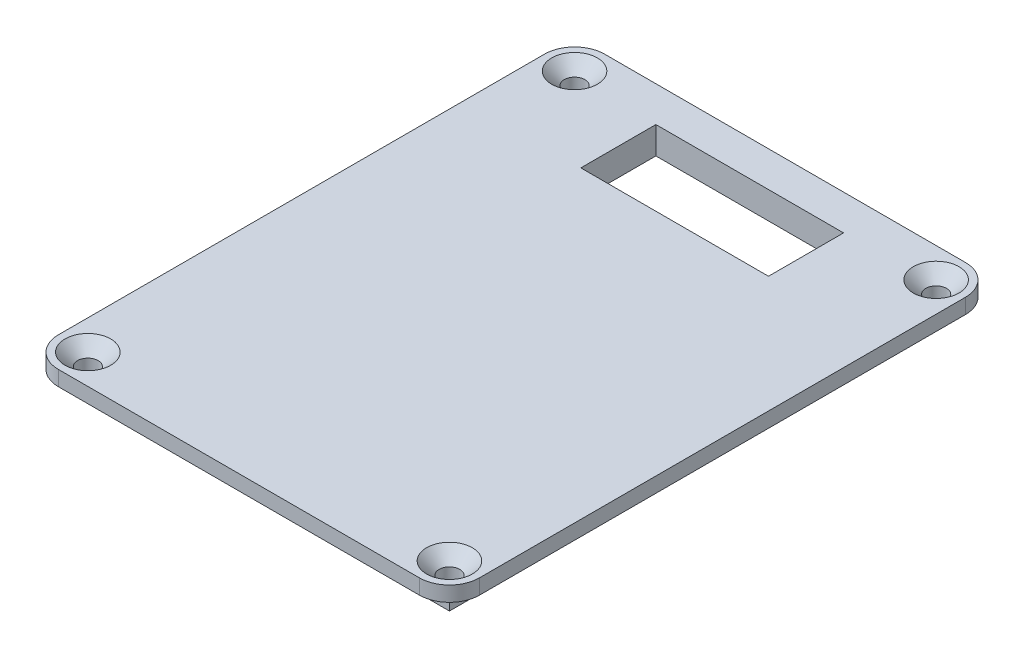
ISO-10303-21;
HEADER;
FILE_DESCRIPTION(('STEP AP214'),'2;1');
FILE_NAME('part.step','',(''),(''),'','','');
FILE_SCHEMA(('AUTOMOTIVE_DESIGN { 1 0 10303 214 1 1 1 1 }'));
ENDSEC;
DATA;
#1=APPLICATION_CONTEXT('core data for automotive mechanical design processes');
#2=APPLICATION_PROTOCOL_DEFINITION('international standard','automotive_design',2000,#1);
#3=PRODUCT_CONTEXT('',#1,'mechanical');
#4=PRODUCT('Part','Part','',(#3));
#5=PRODUCT_RELATED_PRODUCT_CATEGORY('part','',(#4));
#6=PRODUCT_DEFINITION_FORMATION('','',#4);
#7=PRODUCT_DEFINITION_CONTEXT('part definition',#1,'design');
#8=PRODUCT_DEFINITION('design','',#6,#7);
#9=PRODUCT_DEFINITION_SHAPE('','',#8);
#10=(LENGTH_UNIT() NAMED_UNIT(*) SI_UNIT(.MILLI.,.METRE.));
#11=(NAMED_UNIT(*) PLANE_ANGLE_UNIT() SI_UNIT($,.RADIAN.));
#12=(NAMED_UNIT(*) SI_UNIT($,.STERADIAN.) SOLID_ANGLE_UNIT());
#13=UNCERTAINTY_MEASURE_WITH_UNIT(LENGTH_MEASURE(1.E-05),#10,'distance_accuracy_value','');
#14=(GEOMETRIC_REPRESENTATION_CONTEXT(3) GLOBAL_UNCERTAINTY_ASSIGNED_CONTEXT((#13)) GLOBAL_UNIT_ASSIGNED_CONTEXT((#10,
#11,#12)) REPRESENTATION_CONTEXT('',''));
#15=CARTESIAN_POINT('',(0.,0.,0.));
#16=DIRECTION('',(0.,0.,1.));
#17=DIRECTION('',(1.,0.,0.));
#18=AXIS2_PLACEMENT_3D('',#15,#16,#17);
#19=CARTESIAN_POINT('',(-34.115,7.14999999999999,-40.));
#20=DIRECTION('',(0.,1.,0.));
#21=DIRECTION('',(0.,0.,1.));
#22=AXIS2_PLACEMENT_3D('',#19,#20,#21);
#23=PLANE('',#22);
#24=DIRECTION('',(1.,0.,0.));
#25=VECTOR('',#24,1.);
#26=CARTESIAN_POINT('',(15.,7.14999999999999,-38.));
#27=LINE('',#26,#25);
#28=CARTESIAN_POINT('',(-15.,7.14999999999999,-38.));
#29=VERTEX_POINT('',#28);
#30=CARTESIAN_POINT('',(15.,7.14999999999999,-38.));
#31=VERTEX_POINT('',#30);
#32=EDGE_CURVE('E277',#29,#31,#27,.T.);
#33=ORIENTED_EDGE('',*,*,#32,.F.);
#34=DIRECTION('',(0.,0.,-1.));
#35=VECTOR('',#34,1.);
#36=CARTESIAN_POINT('',(-15.,7.14999999999999,-26.));
#37=LINE('',#36,#35);
#38=CARTESIAN_POINT('',(-15.,7.14999999999999,-26.));
#39=VERTEX_POINT('',#38);
#40=EDGE_CURVE('E265',#39,#29,#37,.T.);
#41=ORIENTED_EDGE('',*,*,#40,.F.);
#42=DIRECTION('',(-1.,0.,0.));
#43=VECTOR('',#42,1.);
#44=CARTESIAN_POINT('',(15.,7.14999999999999,-26.));
#45=LINE('',#44,#43);
#46=CARTESIAN_POINT('',(15.,7.14999999999999,-26.));
#47=VERTEX_POINT('',#46);
#48=EDGE_CURVE('E271',#47,#39,#45,.T.);
#49=ORIENTED_EDGE('',*,*,#48,.F.);
#50=DIRECTION('',(0.,0.,1.));
#51=VECTOR('',#50,1.);
#52=CARTESIAN_POINT('',(15.,7.14999999999999,-26.));
#53=LINE('',#52,#51);
#54=EDGE_CURVE('E62',#31,#47,#53,.T.);
#55=ORIENTED_EDGE('',*,*,#54,.F.);
#56=EDGE_LOOP('',(#33,#41,#49,#55));
#57=FACE_BOUND('',#56,.T.);
#58=DIRECTION('',(0.,0.,1.));
#59=VECTOR('',#58,1.);
#60=CARTESIAN_POINT('',(31.5,7.14999999999999,-44.115));
#61=LINE('',#60,#59);
#62=CARTESIAN_POINT('',(31.5,7.14999999999999,-41.5));
#63=VERTEX_POINT('',#62);
#64=CARTESIAN_POINT('',(31.5,7.14999999999999,-19.5));
#65=VERTEX_POINT('',#64);
#66=EDGE_CURVE('E417',#63,#65,#61,.T.);
#67=ORIENTED_EDGE('',*,*,#66,.T.);
#68=DIRECTION('',(1.,0.,0.));
#69=VECTOR('',#68,1.);
#70=CARTESIAN_POINT('',(-29.9999999999999,7.14999999999999,-19.5));
#71=LINE('',#70,#69);
#72=CARTESIAN_POINT('',(-29.9999999999999,7.14999999999999,-19.5));
#73=VERTEX_POINT('',#72);
#74=EDGE_CURVE('E305',#73,#65,#71,.T.);
#75=ORIENTED_EDGE('',*,*,#74,.F.);
#76=DIRECTION('',(0.,0.,-1.));
#77=VECTOR('',#76,1.);
#78=CARTESIAN_POINT('',(-29.9999999999999,7.14999999999999,35.5));
#79=LINE('',#78,#77);
#80=CARTESIAN_POINT('',(-29.9999999999999,7.14999999999999,0.));
#81=VERTEX_POINT('',#80);
#82=EDGE_CURVE('E11',#81,#73,#79,.T.);
#83=ORIENTED_EDGE('',*,*,#82,.F.);
#84=DIRECTION('',(1.,0.,0.));
#85=VECTOR('',#84,1.);
#86=CARTESIAN_POINT('',(-30.,7.14999999999999,0.));
#87=LINE('',#86,#85);
#88=CARTESIAN_POINT('',(-31.5,7.14999999999999,0.));
#89=VERTEX_POINT('',#88);
#90=EDGE_CURVE('E452',#89,#81,#87,.T.);
#91=ORIENTED_EDGE('',*,*,#90,.F.);
#92=DIRECTION('',(0.,0.,-1.));
#93=VECTOR('',#92,1.);
#94=CARTESIAN_POINT('',(-31.5,7.14999999999999,0.));
#95=LINE('',#94,#93);
#96=CARTESIAN_POINT('',(-31.5,7.14999999999999,-41.5));
#97=VERTEX_POINT('',#96);
#98=EDGE_CURVE('E448',#89,#97,#95,.T.);
#99=ORIENTED_EDGE('',*,*,#98,.T.);
#100=DIRECTION('',(1.,0.,0.));
#101=VECTOR('',#100,1.);
#102=CARTESIAN_POINT('',(-34.115,7.14999999999999,-41.5));
#103=LINE('',#102,#101);
#104=EDGE_CURVE('E371',#97,#63,#103,.T.);
#105=ORIENTED_EDGE('',*,*,#104,.T.);
#106=EDGE_LOOP('',(#67,#75,#83,#91,#99,#105));
#107=FACE_BOUND('',#106,.T.);
#108=CARTESIAN_POINT('',(28.9,7.14999999999999,-38.9));
#109=DIRECTION('',(0.,1.,0.));
#110=DIRECTION('',(0.,0.,1.));
#111=AXIS2_PLACEMENT_3D('',#108,#109,#110);
#112=CIRCLE('',#111,1.65);
#113=CARTESIAN_POINT('',(30.0667261889578,7.14999999999999,-40.0667261889578));
#114=VERTEX_POINT('',#113);
#115=EDGE_CURVE('E486',#114,#114,#112,.T.);
#116=ORIENTED_EDGE('',*,*,#115,.T.);
#117=EDGE_LOOP('',(#116));
#118=FACE_BOUND('',#117,.T.);
#119=CARTESIAN_POINT('',(-28.9,7.14999999999999,-38.9));
#120=DIRECTION('',(0.,1.,0.));
#121=DIRECTION('',(0.,0.,1.));
#122=AXIS2_PLACEMENT_3D('',#119,#120,#121);
#123=CIRCLE('',#122,1.65);
#124=CARTESIAN_POINT('',(-30.0667261889578,7.14999999999999,-40.0667261889578));
#125=VERTEX_POINT('',#124);
#126=EDGE_CURVE('E491',#125,#125,#123,.T.);
#127=ORIENTED_EDGE('',*,*,#126,.T.);
#128=EDGE_LOOP('',(#127));
#129=FACE_BOUND('',#128,.T.);
#130=ADVANCED_FACE('F43',(#57,#107,#118,#129),#23,.F.);
#131=CARTESIAN_POINT('',(34.115,9.09999999999999,41.5));
#132=DIRECTION('',(0.,1.,0.));
#133=DIRECTION('',(0.,0.,1.));
#134=AXIS2_PLACEMENT_3D('',#131,#132,#133);
#135=PLANE('',#134);
#136=CARTESIAN_POINT('',(-28.8499999999999,9.09999999999999,38.85));
#137=DIRECTION('',(0.,1.,0.));
#138=DIRECTION('',(0.,0.,1.));
#139=AXIS2_PLACEMENT_3D('',#136,#137,#138);
#140=CIRCLE('',#139,4.8);
#141=CARTESIAN_POINT('',(-32.2441125496954,9.09999999999999,42.2441125496954));
#142=VERTEX_POINT('',#141);
#143=CARTESIAN_POINT('',(-28.8499999999999,9.09999999999999,43.65));
#144=VERTEX_POINT('',#143);
#145=EDGE_CURVE('E367',#142,#144,#140,.T.);
#146=ORIENTED_EDGE('',*,*,#145,.F.);
#147=DIRECTION('',(-0.707106781186547,0.,0.707106781186548));
#148=VECTOR('',#147,1.);
#149=CARTESIAN_POINT('',(-32.8075,9.09999999999999,42.8075));
#150=LINE('',#149,#148);
#151=CARTESIAN_POINT('',(-31.5,9.09999999999999,41.5));
#152=VERTEX_POINT('',#151);
#153=EDGE_CURVE('E442',#152,#142,#150,.T.);
#154=ORIENTED_EDGE('',*,*,#153,.F.);
#155=DIRECTION('',(-1.,0.,0.));
#156=VECTOR('',#155,1.);
#157=CARTESIAN_POINT('',(34.115,9.09999999999999,41.5));
#158=LINE('',#157,#156);
#159=CARTESIAN_POINT('',(31.5,9.09999999999999,41.5));
#160=VERTEX_POINT('',#159);
#161=EDGE_CURVE('E471',#160,#152,#158,.T.);
#162=ORIENTED_EDGE('',*,*,#161,.F.);
#163=DIRECTION('',(0.707106781186548,0.,0.707106781186548));
#164=VECTOR('',#163,1.);
#165=CARTESIAN_POINT('',(-11.3075,9.09999999999999,-1.30749999999999));
#166=LINE('',#165,#164);
#167=CARTESIAN_POINT('',(32.2441125496954,9.09999999999999,42.2441125496954));
#168=VERTEX_POINT('',#167);
#169=EDGE_CURVE('E391',#160,#168,#166,.T.);
#170=ORIENTED_EDGE('',*,*,#169,.T.);
#171=CARTESIAN_POINT('',(28.85,9.09999999999999,38.85));
#172=DIRECTION('',(0.,1.,0.));
#173=DIRECTION('',(0.,0.,1.));
#174=AXIS2_PLACEMENT_3D('',#171,#172,#173);
#175=CIRCLE('',#174,4.8);
#176=CARTESIAN_POINT('',(28.85,9.09999999999999,43.65));
#177=VERTEX_POINT('',#176);
#178=EDGE_CURVE('E362',#177,#168,#175,.T.);
#179=ORIENTED_EDGE('',*,*,#178,.F.);
#180=DIRECTION('',(-1.,0.,0.));
#181=VECTOR('',#180,1.);
#182=CARTESIAN_POINT('',(34.115,9.09999999999999,43.65));
#183=LINE('',#182,#181);
#184=EDGE_CURVE('E477',#177,#144,#183,.T.);
#185=ORIENTED_EDGE('',*,*,#184,.T.);
#186=EDGE_LOOP('',(#146,#154,#162,#170,#179,#185));
#187=FACE_BOUND('',#186,.T.);
#188=ADVANCED_FACE('F595',(#187),#135,.F.);
#189=CARTESIAN_POINT('',(34.115,9.09999999999999,43.65));
#190=DIRECTION('',(0.,0.,-1.));
#191=DIRECTION('',(-1.,0.,0.));
#192=AXIS2_PLACEMENT_3D('',#189,#190,#191);
#193=PLANE('',#192);
#194=DIRECTION('',(0.,1.,0.));
#195=VECTOR('',#194,1.);
#196=CARTESIAN_POINT('',(-28.8499999999999,-11.5,43.65));
#197=LINE('',#196,#195);
#198=CARTESIAN_POINT('',(-28.8499999999999,11.5,43.65));
#199=VERTEX_POINT('',#198);
#200=EDGE_CURVE('E334',#144,#199,#197,.T.);
#201=ORIENTED_EDGE('',*,*,#200,.F.);
#202=ORIENTED_EDGE('',*,*,#184,.F.);
#203=DIRECTION('',(0.,1.,0.));
#204=VECTOR('',#203,1.);
#205=CARTESIAN_POINT('',(28.85,-11.5,43.65));
#206=LINE('',#205,#204);
#207=CARTESIAN_POINT('',(28.85,11.5,43.65));
#208=VERTEX_POINT('',#207);
#209=EDGE_CURVE('E353',#177,#208,#206,.T.);
#210=ORIENTED_EDGE('',*,*,#209,.T.);
#211=DIRECTION('',(-1.,0.,0.));
#212=VECTOR('',#211,1.);
#213=CARTESIAN_POINT('',(34.115,11.5,43.65));
#214=LINE('',#213,#212);
#215=EDGE_CURVE('E432',#208,#199,#214,.T.);
#216=ORIENTED_EDGE('',*,*,#215,.T.);
#217=EDGE_LOOP('',(#201,#202,#210,#216));
#218=FACE_BOUND('',#217,.T.);
#219=ADVANCED_FACE('F599',(#218),#193,.F.);
#220=CARTESIAN_POINT('',(-31.5,9.09999999999999,44.115));
#221=DIRECTION('',(0.,1.,0.));
#222=DIRECTION('',(0.,0.,1.));
#223=AXIS2_PLACEMENT_3D('',#220,#221,#222);
#224=PLANE('',#223);
#225=CARTESIAN_POINT('',(-28.8499999999999,9.09999999999999,38.85));
#226=DIRECTION('',(0.,1.,0.));
#227=DIRECTION('',(0.,0.,1.));
#228=AXIS2_PLACEMENT_3D('',#225,#226,#227);
#229=CIRCLE('',#228,4.8);
#230=CARTESIAN_POINT('',(-33.65,9.09999999999999,38.85));
#231=VERTEX_POINT('',#230);
#232=EDGE_CURVE('E366',#231,#142,#229,.T.);
#233=ORIENTED_EDGE('',*,*,#232,.F.);
#234=DIRECTION('',(0.,0.,-1.));
#235=VECTOR('',#234,1.);
#236=CARTESIAN_POINT('',(-33.65,9.09999999999999,44.115));
#237=LINE('',#236,#235);
#238=CARTESIAN_POINT('',(-33.65,9.09999999999999,0.));
#239=VERTEX_POINT('',#238);
#240=EDGE_CURVE('E428',#231,#239,#237,.T.);
#241=ORIENTED_EDGE('',*,*,#240,.T.);
#242=DIRECTION('',(1.,0.,0.));
#243=VECTOR('',#242,1.);
#244=CARTESIAN_POINT('',(-31.5,9.09999999999999,0.));
#245=LINE('',#244,#243);
#246=CARTESIAN_POINT('',(-31.5,9.09999999999999,0.));
#247=VERTEX_POINT('',#246);
#248=EDGE_CURVE('E437',#239,#247,#245,.T.);
#249=ORIENTED_EDGE('',*,*,#248,.T.);
#250=DIRECTION('',(0.,0.,-1.));
#251=VECTOR('',#250,1.);
#252=CARTESIAN_POINT('',(-31.5,9.09999999999999,44.115));
#253=LINE('',#252,#251);
#254=EDGE_CURVE('E435',#152,#247,#253,.T.);
#255=ORIENTED_EDGE('',*,*,#254,.F.);
#256=ORIENTED_EDGE('',*,*,#153,.T.);
#257=EDGE_LOOP('',(#233,#241,#249,#255,#256));
#258=FACE_BOUND('',#257,.T.);
#259=ADVANCED_FACE('F654',(#258),#224,.F.);
#260=CARTESIAN_POINT('',(-31.5,9.09999999999999,0.));
#261=DIRECTION('',(0.,1.,0.));
#262=DIRECTION('',(0.,0.,1.));
#263=AXIS2_PLACEMENT_3D('',#260,#261,#262);
#264=PLANE('',#263);
#265=CARTESIAN_POINT('',(-28.85,9.09999999999999,-38.85));
#266=DIRECTION('',(0.,1.,0.));
#267=DIRECTION('',(0.,0.,1.));
#268=AXIS2_PLACEMENT_3D('',#265,#266,#267);
#269=CIRCLE('',#268,4.79999999999999);
#270=CARTESIAN_POINT('',(-32.2441125496954,9.09999999999999,-42.2441125496954));
#271=VERTEX_POINT('',#270);
#272=CARTESIAN_POINT('',(-33.6499999999999,9.09999999999999,-38.85));
#273=VERTEX_POINT('',#272);
#274=EDGE_CURVE('E359',#271,#273,#269,.T.);
#275=ORIENTED_EDGE('',*,*,#274,.F.);
#276=DIRECTION('',(-0.707106781186548,0.,-0.707106781186548));
#277=VECTOR('',#276,1.);
#278=CARTESIAN_POINT('',(-32.8075,9.09999999999999,-42.8075));
#279=LINE('',#278,#277);
#280=CARTESIAN_POINT('',(-31.5,9.09999999999999,-41.5));
#281=VERTEX_POINT('',#280);
#282=EDGE_CURVE('E384',#281,#271,#279,.T.);
#283=ORIENTED_EDGE('',*,*,#282,.F.);
#284=DIRECTION('',(0.,0.,-1.));
#285=VECTOR('',#284,1.);
#286=CARTESIAN_POINT('',(-31.5,9.09999999999999,0.));
#287=LINE('',#286,#285);
#288=EDGE_CURVE('E467',#247,#281,#287,.T.);
#289=ORIENTED_EDGE('',*,*,#288,.F.);
#290=ORIENTED_EDGE('',*,*,#248,.F.);
#291=DIRECTION('',(0.,0.,-1.));
#292=VECTOR('',#291,1.);
#293=CARTESIAN_POINT('',(-33.65,9.09999999999999,0.));
#294=LINE('',#293,#292);
#295=EDGE_CURVE('E464',#239,#273,#294,.T.);
#296=ORIENTED_EDGE('',*,*,#295,.T.);
#297=EDGE_LOOP('',(#275,#283,#289,#290,#296));
#298=FACE_BOUND('',#297,.T.);
#299=ADVANCED_FACE('F650',(#298),#264,.F.);
#300=CARTESIAN_POINT('',(31.5,9.09999999999999,-44.115));
#301=DIRECTION('',(0.,1.,0.));
#302=DIRECTION('',(0.,0.,1.));
#303=AXIS2_PLACEMENT_3D('',#300,#301,#302);
#304=PLANE('',#303);
#305=CARTESIAN_POINT('',(28.85,9.09999999999999,-38.85));
#306=DIRECTION('',(0.,1.,0.));
#307=DIRECTION('',(0.,0.,1.));
#308=AXIS2_PLACEMENT_3D('',#305,#306,#307);
#309=CIRCLE('',#308,4.8);
#310=CARTESIAN_POINT('',(33.65,9.09999999999999,-38.85));
#311=VERTEX_POINT('',#310);
#312=CARTESIAN_POINT('',(32.2441125496954,9.09999999999999,-42.2441125496954));
#313=VERTEX_POINT('',#312);
#314=EDGE_CURVE('E356',#311,#313,#309,.T.);
#315=ORIENTED_EDGE('',*,*,#314,.F.);
#316=DIRECTION('',(0.,0.,1.));
#317=VECTOR('',#316,1.);
#318=CARTESIAN_POINT('',(33.65,9.09999999999999,-44.115));
#319=LINE('',#318,#317);
#320=CARTESIAN_POINT('',(33.65,9.09999999999999,38.85));
#321=VERTEX_POINT('',#320);
#322=EDGE_CURVE('E425',#311,#321,#319,.T.);
#323=ORIENTED_EDGE('',*,*,#322,.T.);
#324=CARTESIAN_POINT('',(28.85,9.09999999999999,38.85));
#325=DIRECTION('',(0.,1.,0.));
#326=DIRECTION('',(0.,0.,1.));
#327=AXIS2_PLACEMENT_3D('',#324,#325,#326);
#328=CIRCLE('',#327,4.8);
#329=EDGE_CURVE('E365',#168,#321,#328,.T.);
#330=ORIENTED_EDGE('',*,*,#329,.F.);
#331=ORIENTED_EDGE('',*,*,#169,.F.);
#332=DIRECTION('',(0.,0.,1.));
#333=VECTOR('',#332,1.);
#334=CARTESIAN_POINT('',(31.5,9.09999999999999,-44.115));
#335=LINE('',#334,#333);
#336=CARTESIAN_POINT('',(31.5,9.09999999999999,-41.5));
#337=VERTEX_POINT('',#336);
#338=EDGE_CURVE('E416',#337,#160,#335,.T.);
#339=ORIENTED_EDGE('',*,*,#338,.F.);
#340=DIRECTION('',(0.707106781186547,0.,-0.707106781186548));
#341=VECTOR('',#340,1.);
#342=CARTESIAN_POINT('',(-1.30749999999998,9.09999999999999,-8.69250000000002));
#343=LINE('',#342,#341);
#344=EDGE_CURVE('E378',#337,#313,#343,.T.);
#345=ORIENTED_EDGE('',*,*,#344,.T.);
#346=EDGE_LOOP('',(#315,#323,#330,#331,#339,#345));
#347=FACE_BOUND('',#346,.T.);
#348=ADVANCED_FACE('F564',(#347),#304,.F.);
#349=CARTESIAN_POINT('',(33.65,9.09999999999999,-44.115));
#350=DIRECTION('',(-1.,0.,0.));
#351=DIRECTION('',(0.,0.,1.));
#352=AXIS2_PLACEMENT_3D('',#349,#350,#351);
#353=PLANE('',#352);
#354=DIRECTION('',(0.,1.,0.));
#355=VECTOR('',#354,1.);
#356=CARTESIAN_POINT('',(33.65,-11.5,38.85));
#357=LINE('',#356,#355);
#358=CARTESIAN_POINT('',(33.65,11.5,38.85));
#359=VERTEX_POINT('',#358);
#360=EDGE_CURVE('E350',#321,#359,#357,.T.);
#361=ORIENTED_EDGE('',*,*,#360,.F.);
#362=ORIENTED_EDGE('',*,*,#322,.F.);
#363=DIRECTION('',(0.,1.,0.));
#364=VECTOR('',#363,1.);
#365=CARTESIAN_POINT('',(33.65,-11.5,-38.85));
#366=LINE('',#365,#364);
#367=CARTESIAN_POINT('',(33.65,11.5,-38.85));
#368=VERTEX_POINT('',#367);
#369=EDGE_CURVE('E339',#311,#368,#366,.T.);
#370=ORIENTED_EDGE('',*,*,#369,.T.);
#371=DIRECTION('',(0.,0.,1.));
#372=VECTOR('',#371,1.);
#373=CARTESIAN_POINT('',(33.65,11.5,-44.115));
#374=LINE('',#373,#372);
#375=EDGE_CURVE('E414',#368,#359,#374,.T.);
#376=ORIENTED_EDGE('',*,*,#375,.T.);
#377=EDGE_LOOP('',(#361,#362,#370,#376));
#378=FACE_BOUND('',#377,.T.);
#379=ADVANCED_FACE('F670',(#378),#353,.F.);
#380=CARTESIAN_POINT('',(-34.115,9.09999999999999,-41.5));
#381=DIRECTION('',(0.,1.,0.));
#382=DIRECTION('',(0.,0.,1.));
#383=AXIS2_PLACEMENT_3D('',#380,#381,#382);
#384=PLANE('',#383);
#385=CARTESIAN_POINT('',(-28.85,9.09999999999999,-38.85));
#386=DIRECTION('',(0.,1.,0.));
#387=DIRECTION('',(0.,0.,1.));
#388=AXIS2_PLACEMENT_3D('',#385,#386,#387);
#389=CIRCLE('',#388,4.79999999999999);
#390=CARTESIAN_POINT('',(-28.85,9.09999999999999,-43.65));
#391=VERTEX_POINT('',#390);
#392=EDGE_CURVE('E358',#391,#271,#389,.T.);
#393=ORIENTED_EDGE('',*,*,#392,.F.);
#394=DIRECTION('',(1.,0.,0.));
#395=VECTOR('',#394,1.);
#396=CARTESIAN_POINT('',(-34.115,9.09999999999999,-43.65));
#397=LINE('',#396,#395);
#398=CARTESIAN_POINT('',(28.85,9.09999999999999,-43.6499999999999));
#399=VERTEX_POINT('',#398);
#400=EDGE_CURVE('E399',#391,#399,#397,.T.);
#401=ORIENTED_EDGE('',*,*,#400,.T.);
#402=CARTESIAN_POINT('',(28.85,9.09999999999999,-38.85));
#403=DIRECTION('',(0.,1.,0.));
#404=DIRECTION('',(0.,0.,1.));
#405=AXIS2_PLACEMENT_3D('',#402,#403,#404);
#406=CIRCLE('',#405,4.8);
#407=EDGE_CURVE('E337',#313,#399,#406,.T.);
#408=ORIENTED_EDGE('',*,*,#407,.F.);
#409=ORIENTED_EDGE('',*,*,#344,.F.);
#410=DIRECTION('',(1.,0.,0.));
#411=VECTOR('',#410,1.);
#412=CARTESIAN_POINT('',(-34.115,9.09999999999999,-41.5));
#413=LINE('',#412,#411);
#414=EDGE_CURVE('E398',#281,#337,#413,.T.);
#415=ORIENTED_EDGE('',*,*,#414,.F.);
#416=ORIENTED_EDGE('',*,*,#282,.T.);
#417=EDGE_LOOP('',(#393,#401,#408,#409,#415,#416));
#418=FACE_BOUND('',#417,.T.);
#419=ADVANCED_FACE('F560',(#418),#384,.F.);
#420=CARTESIAN_POINT('',(-34.115,9.09999999999999,-43.65));
#421=DIRECTION('',(0.,0.,1.));
#422=DIRECTION('',(1.,0.,0.));
#423=AXIS2_PLACEMENT_3D('',#420,#421,#422);
#424=PLANE('',#423);
#425=DIRECTION('',(0.,1.,0.));
#426=VECTOR('',#425,1.);
#427=CARTESIAN_POINT('',(28.85,-11.5,-43.6499999999999));
#428=LINE('',#427,#426);
#429=CARTESIAN_POINT('',(28.85,11.5,-43.6499999999999));
#430=VERTEX_POINT('',#429);
#431=EDGE_CURVE('E345',#399,#430,#428,.T.);
#432=ORIENTED_EDGE('',*,*,#431,.F.);
#433=ORIENTED_EDGE('',*,*,#400,.F.);
#434=DIRECTION('',(0.,1.,0.));
#435=VECTOR('',#434,1.);
#436=CARTESIAN_POINT('',(-28.85,-11.5,-43.6499999999999));
#437=LINE('',#436,#435);
#438=CARTESIAN_POINT('',(-28.85,11.5,-43.6499999999999));
#439=VERTEX_POINT('',#438);
#440=EDGE_CURVE('E338',#391,#439,#437,.T.);
#441=ORIENTED_EDGE('',*,*,#440,.T.);
#442=DIRECTION('',(1.,0.,0.));
#443=VECTOR('',#442,1.);
#444=CARTESIAN_POINT('',(-34.115,11.5,-43.65));
#445=LINE('',#444,#443);
#446=EDGE_CURVE('E341',#439,#430,#445,.T.);
#447=ORIENTED_EDGE('',*,*,#446,.T.);
#448=EDGE_LOOP('',(#432,#433,#441,#447));
#449=FACE_BOUND('',#448,.T.);
#450=ADVANCED_FACE('F608',(#449),#424,.F.);
#451=CARTESIAN_POINT('',(34.115,7.14999999999999,41.5));
#452=DIRECTION('',(0.,0.,-1.));
#453=DIRECTION('',(-1.,0.,0.));
#454=AXIS2_PLACEMENT_3D('',#451,#452,#453);
#455=PLANE('',#454);
#456=DIRECTION('',(-1.,0.,0.));
#457=VECTOR('',#456,1.);
#458=CARTESIAN_POINT('',(34.115,7.14999999999999,41.5));
#459=LINE('',#458,#457);
#460=CARTESIAN_POINT('',(31.5,7.14999999999999,41.5));
#461=VERTEX_POINT('',#460);
#462=CARTESIAN_POINT('',(-31.5,7.14999999999999,41.5));
#463=VERTEX_POINT('',#462);
#464=EDGE_CURVE('E369',#461,#463,#459,.T.);
#465=ORIENTED_EDGE('',*,*,#464,.F.);
#466=DIRECTION('',(0.,1.,0.));
#467=VECTOR('',#466,1.);
#468=CARTESIAN_POINT('',(31.5,7.14999999999999,41.5));
#469=LINE('',#468,#467);
#470=EDGE_CURVE('E406',#461,#160,#469,.T.);
#471=ORIENTED_EDGE('',*,*,#470,.T.);
#472=ORIENTED_EDGE('',*,*,#161,.T.);
#473=DIRECTION('',(0.,1.,0.));
#474=VECTOR('',#473,1.);
#475=CARTESIAN_POINT('',(-31.5,7.14999999999999,41.5));
#476=LINE('',#475,#474);
#477=EDGE_CURVE('E441',#463,#152,#476,.T.);
#478=ORIENTED_EDGE('',*,*,#477,.F.);
#479=EDGE_LOOP('',(#465,#471,#472,#478));
#480=FACE_BOUND('',#479,.T.);
#481=ADVANCED_FACE('F568',(#480),#455,.F.);
#482=CARTESIAN_POINT('',(-33.65,9.09999999999999,44.115));
#483=DIRECTION('',(1.,0.,0.));
#484=DIRECTION('',(0.,0.,-1.));
#485=AXIS2_PLACEMENT_3D('',#482,#483,#484);
#486=PLANE('',#485);
#487=ORIENTED_EDGE('',*,*,#240,.F.);
#488=DIRECTION('',(0.,1.,0.));
#489=VECTOR('',#488,1.);
#490=CARTESIAN_POINT('',(-33.6499999999999,-11.5,38.85));
#491=LINE('',#490,#489);
#492=CARTESIAN_POINT('',(-33.6499999999999,11.5,38.85));
#493=VERTEX_POINT('',#492);
#494=EDGE_CURVE('E335',#231,#493,#491,.T.);
#495=ORIENTED_EDGE('',*,*,#494,.T.);
#496=DIRECTION('',(0.,0.,-1.));
#497=VECTOR('',#496,1.);
#498=CARTESIAN_POINT('',(-33.65,11.5,44.115));
#499=LINE('',#498,#497);
#500=CARTESIAN_POINT('',(-33.65,11.5,0.));
#501=VERTEX_POINT('',#500);
#502=EDGE_CURVE('E426',#493,#501,#499,.T.);
#503=ORIENTED_EDGE('',*,*,#502,.T.);
#504=DIRECTION('',(0.,0.,-1.));
#505=VECTOR('',#504,1.);
#506=CARTESIAN_POINT('',(-33.65,11.5,0.));
#507=LINE('',#506,#505);
#508=CARTESIAN_POINT('',(-33.65,11.5,-38.85));
#509=VERTEX_POINT('',#508);
#510=EDGE_CURVE('E459',#501,#509,#507,.T.);
#511=ORIENTED_EDGE('',*,*,#510,.T.);
#512=DIRECTION('',(0.,1.,0.));
#513=VECTOR('',#512,1.);
#514=CARTESIAN_POINT('',(-33.6499999999999,-11.5,-38.85));
#515=LINE('',#514,#513);
#516=EDGE_CURVE('E340',#273,#509,#515,.T.);
#517=ORIENTED_EDGE('',*,*,#516,.F.);
#518=ORIENTED_EDGE('',*,*,#295,.F.);
#519=EDGE_LOOP('',(#487,#495,#503,#511,#517,#518));
#520=FACE_BOUND('',#519,.T.);
#521=ADVANCED_FACE('F643',(#520),#486,.F.);
#522=CARTESIAN_POINT('',(-31.5,7.14999999999999,44.115));
#523=DIRECTION('',(1.,0.,0.));
#524=DIRECTION('',(0.,0.,-1.));
#525=AXIS2_PLACEMENT_3D('',#522,#523,#524);
#526=PLANE('',#525);
#527=ORIENTED_EDGE('',*,*,#477,.T.);
#528=ORIENTED_EDGE('',*,*,#254,.T.);
#529=DIRECTION('',(0.,-1.,0.));
#530=VECTOR('',#529,1.);
#531=CARTESIAN_POINT('',(-31.5,7.14999999999999,0.));
#532=LINE('',#531,#530);
#533=EDGE_CURVE('E451',#247,#89,#532,.T.);
#534=ORIENTED_EDGE('',*,*,#533,.T.);
#535=DIRECTION('',(0.,0.,-1.));
#536=VECTOR('',#535,1.);
#537=CARTESIAN_POINT('',(-31.5,7.14999999999999,44.115));
#538=LINE('',#537,#536);
#539=EDGE_CURVE('E433',#463,#89,#538,.T.);
#540=ORIENTED_EDGE('',*,*,#539,.F.);
#541=EDGE_LOOP('',(#527,#528,#534,#540));
#542=FACE_BOUND('',#541,.T.);
#543=ADVANCED_FACE('F933',(#542),#526,.F.);
#544=CARTESIAN_POINT('',(-31.5,7.14999999999999,0.));
#545=DIRECTION('',(1.,0.,0.));
#546=DIRECTION('',(0.,0.,-1.));
#547=AXIS2_PLACEMENT_3D('',#544,#545,#546);
#548=PLANE('',#547);
#549=ORIENTED_EDGE('',*,*,#98,.F.);
#550=ORIENTED_EDGE('',*,*,#533,.F.);
#551=ORIENTED_EDGE('',*,*,#288,.T.);
#552=DIRECTION('',(0.,1.,0.));
#553=VECTOR('',#552,1.);
#554=CARTESIAN_POINT('',(-31.5,7.14999999999999,-41.5));
#555=LINE('',#554,#553);
#556=EDGE_CURVE('E389',#97,#281,#555,.T.);
#557=ORIENTED_EDGE('',*,*,#556,.F.);
#558=EDGE_LOOP('',(#549,#550,#551,#557));
#559=FACE_BOUND('',#558,.T.);
#560=ADVANCED_FACE('F616',(#559),#548,.F.);
#561=CARTESIAN_POINT('',(31.5,7.14999999999999,-44.115));
#562=DIRECTION('',(-1.,0.,0.));
#563=DIRECTION('',(0.,0.,1.));
#564=AXIS2_PLACEMENT_3D('',#561,#562,#563);
#565=PLANE('',#564);
#566=CARTESIAN_POINT('',(31.5,7.14999999999999,35.5));
#567=VERTEX_POINT('',#566);
#568=EDGE_CURVE('E418',#567,#461,#61,.T.);
#569=ORIENTED_EDGE('',*,*,#568,.F.);
#570=DIRECTION('',(0.,1.,0.));
#571=VECTOR('',#570,1.);
#572=CARTESIAN_POINT('',(31.5,7.14999999999999,35.5));
#573=LINE('',#572,#571);
#574=CARTESIAN_POINT('',(31.5,8.64999999999999,35.5));
#575=VERTEX_POINT('',#574);
#576=EDGE_CURVE('E48',#567,#575,#573,.T.);
#577=ORIENTED_EDGE('',*,*,#576,.T.);
#578=DIRECTION('',(0.,0.,-1.));
#579=VECTOR('',#578,1.);
#580=CARTESIAN_POINT('',(31.5,8.65,-44.115));
#581=LINE('',#580,#579);
#582=CARTESIAN_POINT('',(31.5,8.65,-19.5));
#583=VERTEX_POINT('',#582);
#584=EDGE_CURVE('E523',#575,#583,#581,.T.);
#585=ORIENTED_EDGE('',*,*,#584,.T.);
#586=DIRECTION('',(0.,-1.,0.));
#587=VECTOR('',#586,1.);
#588=CARTESIAN_POINT('',(31.5,7.14999999999999,-19.5));
#589=LINE('',#588,#587);
#590=EDGE_CURVE('E520',#583,#65,#589,.T.);
#591=ORIENTED_EDGE('',*,*,#590,.T.);
#592=ORIENTED_EDGE('',*,*,#66,.F.);
#593=DIRECTION('',(0.,1.,0.));
#594=VECTOR('',#593,1.);
#595=CARTESIAN_POINT('',(31.5,7.14999999999999,-41.5));
#596=LINE('',#595,#594);
#597=EDGE_CURVE('E379',#63,#337,#596,.T.);
#598=ORIENTED_EDGE('',*,*,#597,.T.);
#599=ORIENTED_EDGE('',*,*,#338,.T.);
#600=ORIENTED_EDGE('',*,*,#470,.F.);
#601=EDGE_LOOP('',(#569,#577,#585,#591,#592,#598,#599,#600));
#602=FACE_BOUND('',#601,.T.);
#603=ADVANCED_FACE('F529',(#602),#565,.F.);
#604=CARTESIAN_POINT('',(-34.115,11.5,-43.65));
#605=DIRECTION('',(0.,-1.,0.));
#606=DIRECTION('',(0.,0.,-1.));
#607=AXIS2_PLACEMENT_3D('',#604,#605,#606);
#608=PLANE('',#607);
#609=DIRECTION('',(1.,0.,0.));
#610=VECTOR('',#609,1.);
#611=CARTESIAN_POINT('',(15.,11.5,-26.));
#612=LINE('',#611,#610);
#613=CARTESIAN_POINT('',(-15.,11.5,-26.));
#614=VERTEX_POINT('',#613);
#615=CARTESIAN_POINT('',(15.,11.5,-26.));
#616=VERTEX_POINT('',#615);
#617=EDGE_CURVE('E279',#614,#616,#612,.T.);
#618=ORIENTED_EDGE('',*,*,#617,.F.);
#619=DIRECTION('',(0.,0.,1.));
#620=VECTOR('',#619,1.);
#621=CARTESIAN_POINT('',(-15.,11.5,-26.));
#622=LINE('',#621,#620);
#623=CARTESIAN_POINT('',(-15.,11.5,-38.));
#624=VERTEX_POINT('',#623);
#625=EDGE_CURVE('E69',#624,#614,#622,.T.);
#626=ORIENTED_EDGE('',*,*,#625,.F.);
#627=DIRECTION('',(-1.,0.,0.));
#628=VECTOR('',#627,1.);
#629=CARTESIAN_POINT('',(15.,11.5,-38.));
#630=LINE('',#629,#628);
#631=CARTESIAN_POINT('',(15.,11.5,-38.));
#632=VERTEX_POINT('',#631);
#633=EDGE_CURVE('E268',#632,#624,#630,.T.);
#634=ORIENTED_EDGE('',*,*,#633,.F.);
#635=DIRECTION('',(0.,0.,-1.));
#636=VECTOR('',#635,1.);
#637=CARTESIAN_POINT('',(15.,11.5,-26.));
#638=LINE('',#637,#636);
#639=EDGE_CURVE('E287',#616,#632,#638,.T.);
#640=ORIENTED_EDGE('',*,*,#639,.F.);
#641=EDGE_LOOP('',(#618,#626,#634,#640));
#642=FACE_BOUND('',#641,.T.);
#643=CARTESIAN_POINT('',(28.85,11.5,38.85));
#644=DIRECTION('',(0.,1.,0.));
#645=DIRECTION('',(0.,0.,1.));
#646=AXIS2_PLACEMENT_3D('',#643,#644,#645);
#647=CIRCLE('',#646,4.8);
#648=CARTESIAN_POINT('',(32.2441125496954,11.5,42.2441125496954));
#649=VERTEX_POINT('',#648);
#650=EDGE_CURVE('E317',#649,#359,#647,.T.);
#651=ORIENTED_EDGE('',*,*,#650,.T.);
#652=ORIENTED_EDGE('',*,*,#375,.F.);
#653=CARTESIAN_POINT('',(28.85,11.5,-38.85));
#654=DIRECTION('',(0.,1.,0.));
#655=DIRECTION('',(0.,0.,-1.));
#656=AXIS2_PLACEMENT_3D('',#653,#654,#655);
#657=CIRCLE('',#656,4.8);
#658=CARTESIAN_POINT('',(32.2441125496954,11.5,-42.2441125496954));
#659=VERTEX_POINT('',#658);
#660=EDGE_CURVE('E324',#368,#659,#657,.T.);
#661=ORIENTED_EDGE('',*,*,#660,.T.);
#662=EDGE_CURVE('E323',#659,#430,#657,.T.);
#663=ORIENTED_EDGE('',*,*,#662,.T.);
#664=ORIENTED_EDGE('',*,*,#446,.F.);
#665=CARTESIAN_POINT('',(-28.85,11.5,-38.85));
#666=DIRECTION('',(0.,1.,0.));
#667=DIRECTION('',(0.,0.,1.));
#668=AXIS2_PLACEMENT_3D('',#665,#666,#667);
#669=CIRCLE('',#668,4.79999999999999);
#670=CARTESIAN_POINT('',(-32.2441125496954,11.5,-42.2441125496954));
#671=VERTEX_POINT('',#670);
#672=EDGE_CURVE('E326',#439,#671,#669,.T.);
#673=ORIENTED_EDGE('',*,*,#672,.T.);
#674=EDGE_CURVE('E329',#671,#509,#669,.T.);
#675=ORIENTED_EDGE('',*,*,#674,.T.);
#676=ORIENTED_EDGE('',*,*,#510,.F.);
#677=ORIENTED_EDGE('',*,*,#502,.F.);
#678=CARTESIAN_POINT('',(-28.8499999999999,11.5,38.85));
#679=DIRECTION('',(0.,1.,0.));
#680=DIRECTION('',(0.,0.,1.));
#681=AXIS2_PLACEMENT_3D('',#678,#679,#680);
#682=CIRCLE('',#681,4.8);
#683=CARTESIAN_POINT('',(-32.2441125496954,11.5,42.2441125496954));
#684=VERTEX_POINT('',#683);
#685=EDGE_CURVE('E316',#493,#684,#682,.T.);
#686=ORIENTED_EDGE('',*,*,#685,.T.);
#687=EDGE_CURVE('E319',#684,#199,#682,.T.);
#688=ORIENTED_EDGE('',*,*,#687,.T.);
#689=ORIENTED_EDGE('',*,*,#215,.F.);
#690=EDGE_CURVE('E321',#208,#649,#647,.T.);
#691=ORIENTED_EDGE('',*,*,#690,.T.);
#692=EDGE_LOOP('',(#651,#652,#661,#663,#664,#673,#675,#676,#677,#686,#688,#689,#691));
#693=FACE_BOUND('',#692,.T.);
#694=CARTESIAN_POINT('',(28.9,11.5,38.9));
#695=DIRECTION('',(0.,-1.,0.));
#696=DIRECTION('',(0.,0.,-1.));
#697=AXIS2_PLACEMENT_3D('',#694,#695,#696);
#698=CIRCLE('',#697,3.65);
#699=CARTESIAN_POINT('',(31.4809397513309,11.5,41.4809397513309));
#700=VERTEX_POINT('',#699);
#701=EDGE_CURVE('E497',#700,#700,#698,.T.);
#702=ORIENTED_EDGE('',*,*,#701,.T.);
#703=EDGE_LOOP('',(#702));
#704=FACE_BOUND('',#703,.T.);
#705=CARTESIAN_POINT('',(-28.9,11.5,38.9));
#706=DIRECTION('',(0.,-1.,0.));
#707=DIRECTION('',(0.,0.,-1.));
#708=AXIS2_PLACEMENT_3D('',#705,#706,#707);
#709=CIRCLE('',#708,3.64999999999999);
#710=CARTESIAN_POINT('',(-31.4809397513309,11.5,41.4809397513309));
#711=VERTEX_POINT('',#710);
#712=EDGE_CURVE('E496',#711,#711,#709,.T.);
#713=ORIENTED_EDGE('',*,*,#712,.T.);
#714=EDGE_LOOP('',(#713));
#715=FACE_BOUND('',#714,.T.);
#716=CARTESIAN_POINT('',(-28.9,11.5,-38.9));
#717=DIRECTION('',(0.,-1.,0.));
#718=DIRECTION('',(0.,0.,-1.));
#719=AXIS2_PLACEMENT_3D('',#716,#717,#718);
#720=CIRCLE('',#719,3.65);
#721=CARTESIAN_POINT('',(-31.4809397513309,11.5,-41.4809397513309));
#722=VERTEX_POINT('',#721);
#723=EDGE_CURVE('E505',#722,#722,#720,.T.);
#724=ORIENTED_EDGE('',*,*,#723,.T.);
#725=EDGE_LOOP('',(#724));
#726=FACE_BOUND('',#725,.T.);
#727=CARTESIAN_POINT('',(28.9,11.5,-38.9));
#728=DIRECTION('',(0.,-1.,0.));
#729=DIRECTION('',(0.,0.,-1.));
#730=AXIS2_PLACEMENT_3D('',#727,#728,#729);
#731=CIRCLE('',#730,3.65000000000003);
#732=CARTESIAN_POINT('',(31.4809397513309,11.5,-41.4809397513309));
#733=VERTEX_POINT('',#732);
#734=EDGE_CURVE('E504',#733,#733,#731,.T.);
#735=ORIENTED_EDGE('',*,*,#734,.T.);
#736=EDGE_LOOP('',(#735));
#737=FACE_BOUND('',#736,.T.);
#738=ADVANCED_FACE('F601',(#642,#693,#704,#715,#726,#737),#608,.F.);
#739=ORIENTED_EDGE('',*,*,#539,.T.);
#740=ORIENTED_EDGE('',*,*,#90,.T.);
#741=CARTESIAN_POINT('',(-29.9999999999999,7.14999999999999,35.5));
#742=VERTEX_POINT('',#741);
#743=EDGE_CURVE('E53',#742,#81,#79,.T.);
#744=ORIENTED_EDGE('',*,*,#743,.F.);
#745=DIRECTION('',(1.,0.,0.));
#746=VECTOR('',#745,1.);
#747=CARTESIAN_POINT('',(-29.9999999999999,7.14999999999999,35.5));
#748=LINE('',#747,#746);
#749=EDGE_CURVE('E304',#742,#567,#748,.T.);
#750=ORIENTED_EDGE('',*,*,#749,.T.);
#751=ORIENTED_EDGE('',*,*,#568,.T.);
#752=ORIENTED_EDGE('',*,*,#464,.T.);
#753=EDGE_LOOP('',(#739,#740,#744,#750,#751,#752));
#754=FACE_BOUND('',#753,.T.);
#755=CARTESIAN_POINT('',(-28.9,7.14999999999999,38.9));
#756=DIRECTION('',(0.,1.,0.));
#757=DIRECTION('',(0.,0.,1.));
#758=AXIS2_PLACEMENT_3D('',#755,#756,#757);
#759=CIRCLE('',#758,1.65);
#760=CARTESIAN_POINT('',(-30.0667261889578,7.14999999999999,40.0667261889578));
#761=VERTEX_POINT('',#760);
#762=EDGE_CURVE('E483',#761,#761,#759,.T.);
#763=ORIENTED_EDGE('',*,*,#762,.T.);
#764=EDGE_LOOP('',(#763));
#765=FACE_BOUND('',#764,.T.);
#766=CARTESIAN_POINT('',(28.9,7.14999999999999,38.9));
#767=DIRECTION('',(0.,1.,0.));
#768=DIRECTION('',(0.,0.,1.));
#769=AXIS2_PLACEMENT_3D('',#766,#767,#768);
#770=CIRCLE('',#769,1.65);
#771=CARTESIAN_POINT('',(30.0667261889578,7.14999999999999,40.0667261889578));
#772=VERTEX_POINT('',#771);
#773=EDGE_CURVE('E485',#772,#772,#770,.T.);
#774=ORIENTED_EDGE('',*,*,#773,.T.);
#775=EDGE_LOOP('',(#774));
#776=FACE_BOUND('',#775,.T.);
#777=ADVANCED_FACE('F540',(#754,#765,#776),#23,.F.);
#778=CARTESIAN_POINT('',(-34.115,7.14999999999999,-41.5));
#779=DIRECTION('',(0.,0.,1.));
#780=DIRECTION('',(1.,0.,0.));
#781=AXIS2_PLACEMENT_3D('',#778,#779,#780);
#782=PLANE('',#781);
#783=ORIENTED_EDGE('',*,*,#556,.T.);
#784=ORIENTED_EDGE('',*,*,#414,.T.);
#785=ORIENTED_EDGE('',*,*,#597,.F.);
#786=ORIENTED_EDGE('',*,*,#104,.F.);
#787=EDGE_LOOP('',(#783,#784,#785,#786));
#788=FACE_BOUND('',#787,.T.);
#789=ADVANCED_FACE('F554',(#788),#782,.F.);
#790=CARTESIAN_POINT('',(28.85,-11.5,-38.85));
#791=DIRECTION('',(0.,1.,0.));
#792=DIRECTION('',(0.,0.,1.));
#793=AXIS2_PLACEMENT_3D('',#790,#791,#792);
#794=CYLINDRICAL_SURFACE('',#793,4.8);
#795=ORIENTED_EDGE('',*,*,#314,.T.);
#796=ORIENTED_EDGE('',*,*,#407,.T.);
#797=ORIENTED_EDGE('',*,*,#431,.T.);
#798=ORIENTED_EDGE('',*,*,#662,.F.);
#799=ORIENTED_EDGE('',*,*,#660,.F.);
#800=ORIENTED_EDGE('',*,*,#369,.F.);
#801=EDGE_LOOP('',(#795,#796,#797,#798,#799,#800));
#802=FACE_BOUND('',#801,.T.);
#803=ADVANCED_FACE('F609',(#802),#794,.T.);
#804=CARTESIAN_POINT('',(-28.85,-11.5,-38.85));
#805=DIRECTION('',(0.,1.,0.));
#806=DIRECTION('',(0.,0.,1.));
#807=AXIS2_PLACEMENT_3D('',#804,#805,#806);
#808=CYLINDRICAL_SURFACE('',#807,4.79999999999999);
#809=ORIENTED_EDGE('',*,*,#274,.T.);
#810=ORIENTED_EDGE('',*,*,#516,.T.);
#811=ORIENTED_EDGE('',*,*,#674,.F.);
#812=ORIENTED_EDGE('',*,*,#672,.F.);
#813=ORIENTED_EDGE('',*,*,#440,.F.);
#814=ORIENTED_EDGE('',*,*,#392,.T.);
#815=EDGE_LOOP('',(#809,#810,#811,#812,#813,#814));
#816=FACE_BOUND('',#815,.T.);
#817=ADVANCED_FACE('F628',(#816),#808,.T.);
#818=CARTESIAN_POINT('',(28.85,-11.5,38.85));
#819=DIRECTION('',(0.,1.,0.));
#820=DIRECTION('',(0.,0.,1.));
#821=AXIS2_PLACEMENT_3D('',#818,#819,#820);
#822=CYLINDRICAL_SURFACE('',#821,4.8);
#823=ORIENTED_EDGE('',*,*,#178,.T.);
#824=ORIENTED_EDGE('',*,*,#329,.T.);
#825=ORIENTED_EDGE('',*,*,#360,.T.);
#826=ORIENTED_EDGE('',*,*,#650,.F.);
#827=ORIENTED_EDGE('',*,*,#690,.F.);
#828=ORIENTED_EDGE('',*,*,#209,.F.);
#829=EDGE_LOOP('',(#823,#824,#825,#826,#827,#828));
#830=FACE_BOUND('',#829,.T.);
#831=ADVANCED_FACE('F624',(#830),#822,.T.);
#832=CARTESIAN_POINT('',(-28.8499999999999,-11.5,38.85));
#833=DIRECTION('',(0.,1.,0.));
#834=DIRECTION('',(0.,0.,1.));
#835=AXIS2_PLACEMENT_3D('',#832,#833,#834);
#836=CYLINDRICAL_SURFACE('',#835,4.8);
#837=ORIENTED_EDGE('',*,*,#145,.T.);
#838=ORIENTED_EDGE('',*,*,#200,.T.);
#839=ORIENTED_EDGE('',*,*,#687,.F.);
#840=ORIENTED_EDGE('',*,*,#685,.F.);
#841=ORIENTED_EDGE('',*,*,#494,.F.);
#842=ORIENTED_EDGE('',*,*,#232,.T.);
#843=EDGE_LOOP('',(#837,#838,#839,#840,#841,#842));
#844=FACE_BOUND('',#843,.T.);
#845=ADVANCED_FACE('F588',(#844),#836,.T.);
#846=CARTESIAN_POINT('',(-28.9,-11.5,38.9));
#847=DIRECTION('',(0.,1.,0.));
#848=DIRECTION('',(0.,0.,1.));
#849=AXIS2_PLACEMENT_3D('',#846,#847,#848);
#850=CYLINDRICAL_SURFACE('',#849,1.65);
#851=CARTESIAN_POINT('',(-28.9,9.50000000000001,38.9));
#852=DIRECTION('',(0.,-1.,0.));
#853=DIRECTION('',(0.,0.,-1.));
#854=AXIS2_PLACEMENT_3D('',#851,#852,#853);
#855=CIRCLE('',#854,1.65);
#856=CARTESIAN_POINT('',(-30.0667261889578,9.50000000000001,40.0667261889578));
#857=VERTEX_POINT('',#856);
#858=EDGE_CURVE('E511',#857,#857,#855,.F.);
#859=ORIENTED_EDGE('',*,*,#858,.T.);
#860=EDGE_LOOP('',(#859));
#861=FACE_BOUND('',#860,.T.);
#862=ORIENTED_EDGE('',*,*,#762,.F.);
#863=EDGE_LOOP('',(#862));
#864=FACE_BOUND('',#863,.T.);
#865=ADVANCED_FACE('F580',(#861,#864),#850,.F.);
#866=CARTESIAN_POINT('',(28.9,-11.5,38.9));
#867=DIRECTION('',(0.,1.,0.));
#868=DIRECTION('',(0.,0.,1.));
#869=AXIS2_PLACEMENT_3D('',#866,#867,#868);
#870=CYLINDRICAL_SURFACE('',#869,1.65);
#871=CARTESIAN_POINT('',(28.9,9.5,38.9));
#872=DIRECTION('',(0.,-1.,0.));
#873=DIRECTION('',(0.,0.,-1.));
#874=AXIS2_PLACEMENT_3D('',#871,#872,#873);
#875=CIRCLE('',#874,1.65);
#876=CARTESIAN_POINT('',(30.0667261889578,9.5,40.0667261889578));
#877=VERTEX_POINT('',#876);
#878=EDGE_CURVE('E512',#877,#877,#875,.F.);
#879=ORIENTED_EDGE('',*,*,#878,.T.);
#880=EDGE_LOOP('',(#879));
#881=FACE_BOUND('',#880,.T.);
#882=ORIENTED_EDGE('',*,*,#773,.F.);
#883=EDGE_LOOP('',(#882));
#884=FACE_BOUND('',#883,.T.);
#885=ADVANCED_FACE('F575',(#881,#884),#870,.F.);
#886=CARTESIAN_POINT('',(28.9,-11.5,-38.9));
#887=DIRECTION('',(0.,1.,0.));
#888=DIRECTION('',(0.,0.,1.));
#889=AXIS2_PLACEMENT_3D('',#886,#887,#888);
#890=CYLINDRICAL_SURFACE('',#889,1.65);
#891=CARTESIAN_POINT('',(28.9,9.49999999999997,-38.9));
#892=DIRECTION('',(0.,-1.,0.));
#893=DIRECTION('',(0.,0.,-1.));
#894=AXIS2_PLACEMENT_3D('',#891,#892,#893);
#895=CIRCLE('',#894,1.65);
#896=CARTESIAN_POINT('',(30.0667261889578,9.49999999999997,-40.0667261889578));
#897=VERTEX_POINT('',#896);
#898=EDGE_CURVE('E348',#897,#897,#895,.F.);
#899=ORIENTED_EDGE('',*,*,#898,.T.);
#900=EDGE_LOOP('',(#899));
#901=FACE_BOUND('',#900,.T.);
#902=ORIENTED_EDGE('',*,*,#115,.F.);
#903=EDGE_LOOP('',(#902));
#904=FACE_BOUND('',#903,.T.);
#905=ADVANCED_FACE('F578',(#901,#904),#890,.F.);
#906=CARTESIAN_POINT('',(-28.9,-11.5,-38.9));
#907=DIRECTION('',(0.,1.,0.));
#908=DIRECTION('',(0.,0.,1.));
#909=AXIS2_PLACEMENT_3D('',#906,#907,#908);
#910=CYLINDRICAL_SURFACE('',#909,1.65);
#911=CARTESIAN_POINT('',(-28.9,9.5,-38.9));
#912=DIRECTION('',(0.,-1.,0.));
#913=DIRECTION('',(0.,0.,-1.));
#914=AXIS2_PLACEMENT_3D('',#911,#912,#913);
#915=CIRCLE('',#914,1.65);
#916=CARTESIAN_POINT('',(-30.0667261889578,9.5,-40.0667261889578));
#917=VERTEX_POINT('',#916);
#918=EDGE_CURVE('E509',#917,#917,#915,.F.);
#919=ORIENTED_EDGE('',*,*,#918,.T.);
#920=EDGE_LOOP('',(#919));
#921=FACE_BOUND('',#920,.T.);
#922=ORIENTED_EDGE('',*,*,#126,.F.);
#923=EDGE_LOOP('',(#922));
#924=FACE_BOUND('',#923,.T.);
#925=ADVANCED_FACE('F584',(#921,#924),#910,.F.);
#926=CARTESIAN_POINT('',(28.9,9.49999999999997,-38.9));
#927=DIRECTION('',(0.,1.,0.));
#928=DIRECTION('',(0.,0.,1.));
#929=AXIS2_PLACEMENT_3D('',#926,#927,#928);
#930=CONICAL_SURFACE('',#929,1.65,0.785398163397451);
#931=DIRECTION('',(-0.500000000000003,-0.707106781186546,0.499999999999999));
#932=VECTOR('',#931,1.);
#933=CARTESIAN_POINT('',(31.4809397513309,11.5,-41.4809397513309));
#934=LINE('',#933,#932);
#935=EDGE_CURVE('E484',#733,#897,#934,.T.);
#936=ORIENTED_EDGE('',*,*,#935,.F.);
#937=ORIENTED_EDGE('',*,*,#734,.F.);
#938=ORIENTED_EDGE('',*,*,#935,.T.);
#939=ORIENTED_EDGE('',*,*,#898,.F.);
#940=EDGE_LOOP('',(#936,#937,#938,#939));
#941=FACE_BOUND('',#940,.T.);
#942=ADVANCED_FACE('F686',(#941),#930,.F.);
#943=CARTESIAN_POINT('',(-28.9,9.5,-38.9));
#944=DIRECTION('',(0.,1.,0.));
#945=DIRECTION('',(0.,0.,1.));
#946=AXIS2_PLACEMENT_3D('',#943,#944,#945);
#947=CONICAL_SURFACE('',#946,1.65,0.785398163397452);
#948=DIRECTION('',(0.5,-0.707106781186547,0.500000000000001));
#949=VECTOR('',#948,1.);
#950=CARTESIAN_POINT('',(-31.4809397513309,11.5,-41.4809397513309));
#951=LINE('',#950,#949);
#952=EDGE_CURVE('E519',#722,#917,#951,.T.);
#953=ORIENTED_EDGE('',*,*,#952,.F.);
#954=ORIENTED_EDGE('',*,*,#723,.F.);
#955=ORIENTED_EDGE('',*,*,#952,.T.);
#956=ORIENTED_EDGE('',*,*,#918,.F.);
#957=EDGE_LOOP('',(#953,#954,#955,#956));
#958=FACE_BOUND('',#957,.T.);
#959=ADVANCED_FACE('F697',(#958),#947,.F.);
#960=CARTESIAN_POINT('',(28.9,9.5,38.9));
#961=DIRECTION('',(0.,1.,0.));
#962=DIRECTION('',(0.,0.,1.));
#963=AXIS2_PLACEMENT_3D('',#960,#961,#962);
#964=CONICAL_SURFACE('',#963,1.65,0.785398163397451);
#965=DIRECTION('',(-0.500000000000002,-0.707106781186546,-0.500000000000001));
#966=VECTOR('',#965,1.);
#967=CARTESIAN_POINT('',(31.4809397513309,11.5,41.4809397513309));
#968=LINE('',#967,#966);
#969=EDGE_CURVE('E522',#700,#877,#968,.T.);
#970=ORIENTED_EDGE('',*,*,#969,.F.);
#971=ORIENTED_EDGE('',*,*,#701,.F.);
#972=ORIENTED_EDGE('',*,*,#969,.T.);
#973=ORIENTED_EDGE('',*,*,#878,.F.);
#974=EDGE_LOOP('',(#970,#971,#972,#973));
#975=FACE_BOUND('',#974,.T.);
#976=ADVANCED_FACE('F954',(#975),#964,.F.);
#977=CARTESIAN_POINT('',(-28.9,9.50000000000001,38.9));
#978=DIRECTION('',(0.,1.,0.));
#979=DIRECTION('',(0.,0.,1.));
#980=AXIS2_PLACEMENT_3D('',#977,#978,#979);
#981=CONICAL_SURFACE('',#980,1.65,0.78539816339745);
#982=DIRECTION('',(0.5,-0.707106781186546,-0.500000000000002));
#983=VECTOR('',#982,1.);
#984=CARTESIAN_POINT('',(-31.4809397513309,11.5,41.4809397513309));
#985=LINE('',#984,#983);
#986=EDGE_CURVE('E306',#711,#857,#985,.T.);
#987=ORIENTED_EDGE('',*,*,#986,.F.);
#988=ORIENTED_EDGE('',*,*,#712,.F.);
#989=ORIENTED_EDGE('',*,*,#986,.T.);
#990=ORIENTED_EDGE('',*,*,#858,.F.);
#991=EDGE_LOOP('',(#987,#988,#989,#990));
#992=FACE_BOUND('',#991,.T.);
#993=ADVANCED_FACE('F46',(#992),#981,.F.);
#994=CARTESIAN_POINT('',(-29.9999999999999,7.14999999999999,35.5));
#995=DIRECTION('',(0.,0.,1.));
#996=DIRECTION('',(1.,0.,0.));
#997=AXIS2_PLACEMENT_3D('',#994,#995,#996);
#998=PLANE('',#997);
#999=ORIENTED_EDGE('',*,*,#749,.F.);
#1000=DIRECTION('',(0.,-1.,0.));
#1001=VECTOR('',#1000,1.);
#1002=CARTESIAN_POINT('',(-29.9999999999999,7.14999999999999,35.5));
#1003=LINE('',#1002,#1001);
#1004=CARTESIAN_POINT('',(-29.9999999999999,8.64999999999999,35.5));
#1005=VERTEX_POINT('',#1004);
#1006=EDGE_CURVE('E303',#1005,#742,#1003,.T.);
#1007=ORIENTED_EDGE('',*,*,#1006,.F.);
#1008=DIRECTION('',(1.,0.,0.));
#1009=VECTOR('',#1008,1.);
#1010=CARTESIAN_POINT('',(-29.9999999999999,8.64999999999999,35.5));
#1011=LINE('',#1010,#1009);
#1012=EDGE_CURVE('E309',#1005,#575,#1011,.T.);
#1013=ORIENTED_EDGE('',*,*,#1012,.T.);
#1014=ORIENTED_EDGE('',*,*,#576,.F.);
#1015=EDGE_LOOP('',(#999,#1007,#1013,#1014));
#1016=FACE_BOUND('',#1015,.T.);
#1017=ADVANCED_FACE('F531',(#1016),#998,.F.);
#1018=CARTESIAN_POINT('',(-29.9999999999999,8.64999999999999,35.5));
#1019=DIRECTION('',(0.,1.,0.));
#1020=DIRECTION('',(0.,0.,1.));
#1021=AXIS2_PLACEMENT_3D('',#1018,#1019,#1020);
#1022=PLANE('',#1021);
#1023=ORIENTED_EDGE('',*,*,#1012,.F.);
#1024=DIRECTION('',(0.,0.,1.));
#1025=VECTOR('',#1024,1.);
#1026=CARTESIAN_POINT('',(-29.9999999999999,8.64999999999999,35.5));
#1027=LINE('',#1026,#1025);
#1028=CARTESIAN_POINT('',(-29.9999999999999,8.65,-19.5));
#1029=VERTEX_POINT('',#1028);
#1030=EDGE_CURVE('E300',#1029,#1005,#1027,.T.);
#1031=ORIENTED_EDGE('',*,*,#1030,.F.);
#1032=DIRECTION('',(1.,0.,0.));
#1033=VECTOR('',#1032,1.);
#1034=CARTESIAN_POINT('',(-29.9999999999999,8.65,-19.5));
#1035=LINE('',#1034,#1033);
#1036=EDGE_CURVE('E315',#1029,#583,#1035,.T.);
#1037=ORIENTED_EDGE('',*,*,#1036,.T.);
#1038=ORIENTED_EDGE('',*,*,#584,.F.);
#1039=EDGE_LOOP('',(#1023,#1031,#1037,#1038));
#1040=FACE_BOUND('',#1039,.T.);
#1041=ADVANCED_FACE('F704',(#1040),#1022,.F.);
#1042=CARTESIAN_POINT('',(-29.9999999999999,7.14999999999999,-19.5));
#1043=DIRECTION('',(0.,0.,-1.));
#1044=DIRECTION('',(-1.,0.,0.));
#1045=AXIS2_PLACEMENT_3D('',#1042,#1043,#1044);
#1046=PLANE('',#1045);
#1047=ORIENTED_EDGE('',*,*,#1036,.F.);
#1048=DIRECTION('',(0.,1.,0.));
#1049=VECTOR('',#1048,1.);
#1050=CARTESIAN_POINT('',(-29.9999999999999,7.14999999999999,-19.5));
#1051=LINE('',#1050,#1049);
#1052=EDGE_CURVE('E293',#73,#1029,#1051,.T.);
#1053=ORIENTED_EDGE('',*,*,#1052,.F.);
#1054=ORIENTED_EDGE('',*,*,#74,.T.);
#1055=ORIENTED_EDGE('',*,*,#590,.F.);
#1056=EDGE_LOOP('',(#1047,#1053,#1054,#1055));
#1057=FACE_BOUND('',#1056,.T.);
#1058=ADVANCED_FACE('F550',(#1057),#1046,.F.);
#1059=CARTESIAN_POINT('',(-29.9999999999999,0.,0.));
#1060=DIRECTION('',(1.,0.,0.));
#1061=DIRECTION('',(0.,0.,-1.));
#1062=AXIS2_PLACEMENT_3D('',#1059,#1060,#1061);
#1063=PLANE('',#1062);
#1064=ORIENTED_EDGE('',*,*,#743,.T.);
#1065=ORIENTED_EDGE('',*,*,#82,.T.);
#1066=ORIENTED_EDGE('',*,*,#1052,.T.);
#1067=ORIENTED_EDGE('',*,*,#1030,.T.);
#1068=ORIENTED_EDGE('',*,*,#1006,.T.);
#1069=EDGE_LOOP('',(#1064,#1065,#1066,#1067,#1068));
#1070=FACE_BOUND('',#1069,.T.);
#1071=ADVANCED_FACE('F545',(#1070),#1063,.T.);
#1072=CARTESIAN_POINT('',(-15.,-11.501,-26.));
#1073=DIRECTION('',(-1.,0.,0.));
#1074=DIRECTION('',(0.,0.,1.));
#1075=AXIS2_PLACEMENT_3D('',#1072,#1073,#1074);
#1076=PLANE('',#1075);
#1077=ORIENTED_EDGE('',*,*,#40,.T.);
#1078=DIRECTION('',(0.,1.,0.));
#1079=VECTOR('',#1078,1.);
#1080=CARTESIAN_POINT('',(-15.,-11.501,-38.));
#1081=LINE('',#1080,#1079);
#1082=EDGE_CURVE('E272',#29,#624,#1081,.T.);
#1083=ORIENTED_EDGE('',*,*,#1082,.T.);
#1084=ORIENTED_EDGE('',*,*,#625,.T.);
#1085=DIRECTION('',(0.,1.,0.));
#1086=VECTOR('',#1085,1.);
#1087=CARTESIAN_POINT('',(-15.,-11.501,-26.));
#1088=LINE('',#1087,#1086);
#1089=EDGE_CURVE('E256',#39,#614,#1088,.T.);
#1090=ORIENTED_EDGE('',*,*,#1089,.F.);
#1091=EDGE_LOOP('',(#1077,#1083,#1084,#1090));
#1092=FACE_BOUND('',#1091,.T.);
#1093=ADVANCED_FACE('F259',(#1092),#1076,.F.);
#1094=CARTESIAN_POINT('',(15.,-11.501,-38.));
#1095=DIRECTION('',(0.,0.,-1.));
#1096=DIRECTION('',(-1.,0.,0.));
#1097=AXIS2_PLACEMENT_3D('',#1094,#1095,#1096);
#1098=PLANE('',#1097);
#1099=ORIENTED_EDGE('',*,*,#32,.T.);
#1100=DIRECTION('',(0.,1.,0.));
#1101=VECTOR('',#1100,1.);
#1102=CARTESIAN_POINT('',(15.,-11.501,-38.));
#1103=LINE('',#1102,#1101);
#1104=EDGE_CURVE('E295',#31,#632,#1103,.T.);
#1105=ORIENTED_EDGE('',*,*,#1104,.T.);
#1106=ORIENTED_EDGE('',*,*,#633,.T.);
#1107=ORIENTED_EDGE('',*,*,#1082,.F.);
#1108=EDGE_LOOP('',(#1099,#1105,#1106,#1107));
#1109=FACE_BOUND('',#1108,.T.);
#1110=ADVANCED_FACE('F715',(#1109),#1098,.F.);
#1111=CARTESIAN_POINT('',(15.,-11.501,-26.));
#1112=DIRECTION('',(1.,0.,0.));
#1113=DIRECTION('',(0.,0.,-1.));
#1114=AXIS2_PLACEMENT_3D('',#1111,#1112,#1113);
#1115=PLANE('',#1114);
#1116=ORIENTED_EDGE('',*,*,#54,.T.);
#1117=DIRECTION('',(0.,1.,0.));
#1118=VECTOR('',#1117,1.);
#1119=CARTESIAN_POINT('',(15.,-11.501,-26.));
#1120=LINE('',#1119,#1118);
#1121=EDGE_CURVE('E270',#47,#616,#1120,.T.);
#1122=ORIENTED_EDGE('',*,*,#1121,.T.);
#1123=ORIENTED_EDGE('',*,*,#639,.T.);
#1124=ORIENTED_EDGE('',*,*,#1104,.F.);
#1125=EDGE_LOOP('',(#1116,#1122,#1123,#1124));
#1126=FACE_BOUND('',#1125,.T.);
#1127=ADVANCED_FACE('F712',(#1126),#1115,.F.);
#1128=CARTESIAN_POINT('',(15.,-11.501,-26.));
#1129=DIRECTION('',(0.,0.,1.));
#1130=DIRECTION('',(1.,0.,0.));
#1131=AXIS2_PLACEMENT_3D('',#1128,#1129,#1130);
#1132=PLANE('',#1131);
#1133=ORIENTED_EDGE('',*,*,#48,.T.);
#1134=ORIENTED_EDGE('',*,*,#1089,.T.);
#1135=ORIENTED_EDGE('',*,*,#617,.T.);
#1136=ORIENTED_EDGE('',*,*,#1121,.F.);
#1137=EDGE_LOOP('',(#1133,#1134,#1135,#1136));
#1138=FACE_BOUND('',#1137,.T.);
#1139=ADVANCED_FACE('F275',(#1138),#1132,.F.);
#1140=CLOSED_SHELL('',(#130,#188,#219,#259,#299,#348,#379,#419,#450,#481,#521,#543,#560,#603,
#738,#777,#789,#803,#817,#831,#845,#865,#885,#905,#925,#942,#959,#976,#993,#1017,#1041,#1058,
#1071,#1093,#1110,#1127,#1139));
#1141=MANIFOLD_SOLID_BREP('B2',#1140);
#1142=ADVANCED_BREP_SHAPE_REPRESENTATION('',(#18,#1141),#14);
#1143=SHAPE_DEFINITION_REPRESENTATION(#9,#1142);
ENDSEC;
END-ISO-10303-21;
